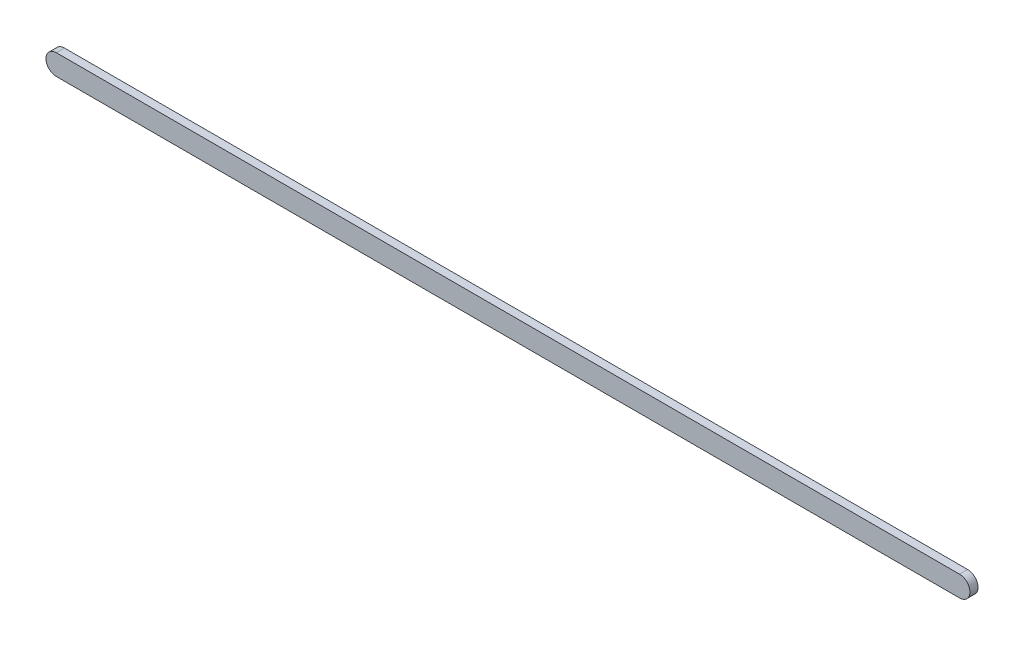
ISO-10303-21;
HEADER;
FILE_DESCRIPTION(('STEP AP214'),'2;1');
FILE_NAME('part.step','',(''),(''),'','','');
FILE_SCHEMA(('AUTOMOTIVE_DESIGN { 1 0 10303 214 1 1 1 1 }'));
ENDSEC;
DATA;
#1=APPLICATION_CONTEXT('core data for automotive mechanical design processes');
#2=APPLICATION_PROTOCOL_DEFINITION('international standard','automotive_design',2000,#1);
#3=PRODUCT_CONTEXT('',#1,'mechanical');
#4=PRODUCT('Part','Part','',(#3));
#5=PRODUCT_RELATED_PRODUCT_CATEGORY('part','',(#4));
#6=PRODUCT_DEFINITION_FORMATION('','',#4);
#7=PRODUCT_DEFINITION_CONTEXT('part definition',#1,'design');
#8=PRODUCT_DEFINITION('design','',#6,#7);
#9=PRODUCT_DEFINITION_SHAPE('','',#8);
#10=(LENGTH_UNIT() NAMED_UNIT(*) SI_UNIT(.MILLI.,.METRE.));
#11=(NAMED_UNIT(*) PLANE_ANGLE_UNIT() SI_UNIT($,.RADIAN.));
#12=(NAMED_UNIT(*) SI_UNIT($,.STERADIAN.) SOLID_ANGLE_UNIT());
#13=UNCERTAINTY_MEASURE_WITH_UNIT(LENGTH_MEASURE(1.E-05),#10,'distance_accuracy_value','');
#14=(GEOMETRIC_REPRESENTATION_CONTEXT(3) GLOBAL_UNCERTAINTY_ASSIGNED_CONTEXT((#13)) GLOBAL_UNIT_ASSIGNED_CONTEXT((#10,
#11,#12)) REPRESENTATION_CONTEXT('',''));
#15=CARTESIAN_POINT('',(0.,0.,0.));
#16=DIRECTION('',(0.,0.,1.));
#17=DIRECTION('',(1.,0.,0.));
#18=AXIS2_PLACEMENT_3D('',#15,#16,#17);
#19=CARTESIAN_POINT('',(109.4550008,58.7820008,0.));
#20=DIRECTION('',(0.,1.,0.));
#21=DIRECTION('',(1.,0.,0.));
#22=AXIS2_PLACEMENT_3D('',#19,#20,#21);
#23=PLANE('',#22);
#24=DIRECTION('',(1.,0.,0.));
#25=VECTOR('',#24,1.);
#26=CARTESIAN_POINT('',(109.4550008,58.7820008,0.1999996));
#27=LINE('',#26,#25);
#28=CARTESIAN_POINT('',(109.4550008,58.7820008,0.1999996));
#29=VERTEX_POINT('',#28);
#30=CARTESIAN_POINT('',(131.7179992,58.7820008,0.1999996));
#31=VERTEX_POINT('',#30);
#32=EDGE_CURVE('E11',#29,#31,#27,.T.);
#33=ORIENTED_EDGE('',*,*,#32,.F.);
#34=DIRECTION('',(0.,0.,1.));
#35=VECTOR('',#34,1.);
#36=CARTESIAN_POINT('',(109.4550008,58.7820008,0.));
#37=LINE('',#36,#35);
#38=CARTESIAN_POINT('',(109.4550008,58.7820008,0.));
#39=VERTEX_POINT('',#38);
#40=EDGE_CURVE('E24',#39,#29,#37,.T.);
#41=ORIENTED_EDGE('',*,*,#40,.F.);
#42=DIRECTION('',(1.,0.,0.));
#43=VECTOR('',#42,1.);
#44=CARTESIAN_POINT('',(109.4550008,58.7820008,0.));
#45=LINE('',#44,#43);
#46=CARTESIAN_POINT('',(131.7179992,58.7820008,0.));
#47=VERTEX_POINT('',#46);
#48=EDGE_CURVE('E75',#39,#47,#45,.T.);
#49=ORIENTED_EDGE('',*,*,#48,.T.);
#50=DIRECTION('',(0.,0.,1.));
#51=VECTOR('',#50,1.);
#52=CARTESIAN_POINT('',(131.7179992,58.7820008,0.));
#53=LINE('',#52,#51);
#54=EDGE_CURVE('E37',#47,#31,#53,.T.);
#55=ORIENTED_EDGE('',*,*,#54,.T.);
#56=EDGE_LOOP('',(#33,#41,#49,#55));
#57=FACE_BOUND('',#56,.T.);
#58=ADVANCED_FACE('F17',(#57),#23,.F.);
#59=CARTESIAN_POINT('',(131.7179992,59.0360008,0.));
#60=DIRECTION('',(0.,0.,-1.));
#61=DIRECTION('',(-1.11896493820492E-13,-1.,0.));
#62=AXIS2_PLACEMENT_3D('',#59,#60,#61);
#63=CYLINDRICAL_SURFACE('',#62,0.253999999999995);
#64=CARTESIAN_POINT('',(131.7179992,59.0360008,0.1999996));
#65=DIRECTION('',(0.,0.,1.));
#66=DIRECTION('',(-1.11896493820492E-13,-1.,0.));
#67=AXIS2_PLACEMENT_3D('',#64,#65,#66);
#68=CIRCLE('',#67,0.253999999999995);
#69=CARTESIAN_POINT('',(131.7179992,59.2900008,0.1999996));
#70=VERTEX_POINT('',#69);
#71=EDGE_CURVE('E83',#31,#70,#68,.T.);
#72=ORIENTED_EDGE('',*,*,#71,.F.);
#73=ORIENTED_EDGE('',*,*,#54,.F.);
#74=CARTESIAN_POINT('',(131.7179992,59.0360008,0.));
#75=DIRECTION('',(0.,0.,1.));
#76=DIRECTION('',(-1.11896493820492E-13,-1.,0.));
#77=AXIS2_PLACEMENT_3D('',#74,#75,#76);
#78=CIRCLE('',#77,0.253999999999995);
#79=CARTESIAN_POINT('',(131.7179992,59.2900008,0.));
#80=VERTEX_POINT('',#79);
#81=EDGE_CURVE('E81',#47,#80,#78,.T.);
#82=ORIENTED_EDGE('',*,*,#81,.T.);
#83=DIRECTION('',(0.,0.,1.));
#84=VECTOR('',#83,1.);
#85=CARTESIAN_POINT('',(131.7179992,59.2900008,0.));
#86=LINE('',#85,#84);
#87=EDGE_CURVE('E67',#80,#70,#86,.T.);
#88=ORIENTED_EDGE('',*,*,#87,.T.);
#89=EDGE_LOOP('',(#72,#73,#82,#88));
#90=FACE_BOUND('',#89,.T.);
#91=ADVANCED_FACE('F89',(#90),#63,.T.);
#92=CARTESIAN_POINT('',(131.7179992,59.2900008,0.));
#93=DIRECTION('',(0.,-1.,0.));
#94=DIRECTION('',(-1.,0.,0.));
#95=AXIS2_PLACEMENT_3D('',#92,#93,#94);
#96=PLANE('',#95);
#97=DIRECTION('',(-1.,0.,0.));
#98=VECTOR('',#97,1.);
#99=CARTESIAN_POINT('',(131.7179992,59.2900008,0.1999996));
#100=LINE('',#99,#98);
#101=CARTESIAN_POINT('',(109.4550008,59.2900008,0.1999996));
#102=VERTEX_POINT('',#101);
#103=EDGE_CURVE('E71',#70,#102,#100,.T.);
#104=ORIENTED_EDGE('',*,*,#103,.F.);
#105=ORIENTED_EDGE('',*,*,#87,.F.);
#106=DIRECTION('',(-1.,0.,0.));
#107=VECTOR('',#106,1.);
#108=CARTESIAN_POINT('',(131.7179992,59.2900008,0.));
#109=LINE('',#108,#107);
#110=CARTESIAN_POINT('',(109.4550008,59.2900008,0.));
#111=VERTEX_POINT('',#110);
#112=EDGE_CURVE('E63',#80,#111,#109,.T.);
#113=ORIENTED_EDGE('',*,*,#112,.T.);
#114=DIRECTION('',(0.,0.,1.));
#115=VECTOR('',#114,1.);
#116=CARTESIAN_POINT('',(109.4550008,59.2900008,0.));
#117=LINE('',#116,#115);
#118=EDGE_CURVE('E53',#111,#102,#117,.T.);
#119=ORIENTED_EDGE('',*,*,#118,.T.);
#120=EDGE_LOOP('',(#104,#105,#113,#119));
#121=FACE_BOUND('',#120,.T.);
#122=ADVANCED_FACE('F66',(#121),#96,.F.);
#123=CARTESIAN_POINT('',(109.4550008,59.0360008,0.));
#124=DIRECTION('',(0.,0.,-1.));
#125=DIRECTION('',(0.,1.,0.));
#126=AXIS2_PLACEMENT_3D('',#123,#124,#125);
#127=CYLINDRICAL_SURFACE('',#126,0.253999999999995);
#128=CARTESIAN_POINT('',(109.4550008,59.0360008,0.1999996));
#129=DIRECTION('',(0.,0.,1.));
#130=DIRECTION('',(0.,1.,0.));
#131=AXIS2_PLACEMENT_3D('',#128,#129,#130);
#132=CIRCLE('',#131,0.253999999999995);
#133=EDGE_CURVE('E59',#102,#29,#132,.T.);
#134=ORIENTED_EDGE('',*,*,#133,.F.);
#135=ORIENTED_EDGE('',*,*,#118,.F.);
#136=CARTESIAN_POINT('',(109.4550008,59.0360008,0.));
#137=DIRECTION('',(0.,0.,1.));
#138=DIRECTION('',(0.,1.,0.));
#139=AXIS2_PLACEMENT_3D('',#136,#137,#138);
#140=CIRCLE('',#139,0.253999999999995);
#141=EDGE_CURVE('E57',#111,#39,#140,.T.);
#142=ORIENTED_EDGE('',*,*,#141,.T.);
#143=ORIENTED_EDGE('',*,*,#40,.T.);
#144=EDGE_LOOP('',(#134,#135,#142,#143));
#145=FACE_BOUND('',#144,.T.);
#146=ADVANCED_FACE('F55',(#145),#127,.T.);
#147=CARTESIAN_POINT('',(109.4550008,58.7820008,0.));
#148=DIRECTION('',(0.,0.,-1.));
#149=DIRECTION('',(-1.,0.,0.));
#150=AXIS2_PLACEMENT_3D('',#147,#148,#149);
#151=PLANE('',#150);
#152=ORIENTED_EDGE('',*,*,#141,.F.);
#153=ORIENTED_EDGE('',*,*,#112,.F.);
#154=ORIENTED_EDGE('',*,*,#81,.F.);
#155=ORIENTED_EDGE('',*,*,#48,.F.);
#156=EDGE_LOOP('',(#152,#153,#154,#155));
#157=FACE_BOUND('',#156,.T.);
#158=ADVANCED_FACE('F74',(#157),#151,.T.);
#159=CARTESIAN_POINT('',(109.4550008,58.7820008,0.1999996));
#160=DIRECTION('',(0.,0.,-1.));
#161=DIRECTION('',(-1.,0.,0.));
#162=AXIS2_PLACEMENT_3D('',#159,#160,#161);
#163=PLANE('',#162);
#164=ORIENTED_EDGE('',*,*,#32,.T.);
#165=ORIENTED_EDGE('',*,*,#71,.T.);
#166=ORIENTED_EDGE('',*,*,#103,.T.);
#167=ORIENTED_EDGE('',*,*,#133,.T.);
#168=EDGE_LOOP('',(#164,#165,#166,#167));
#169=FACE_BOUND('',#168,.T.);
#170=ADVANCED_FACE('F91',(#169),#163,.F.);
#171=CLOSED_SHELL('',(#58,#91,#122,#146,#158,#170));
#172=MANIFOLD_SOLID_BREP('B1',#171);
#173=ADVANCED_BREP_SHAPE_REPRESENTATION('',(#18,#172),#14);
#174=SHAPE_DEFINITION_REPRESENTATION(#9,#173);
ENDSEC;
END-ISO-10303-21;
